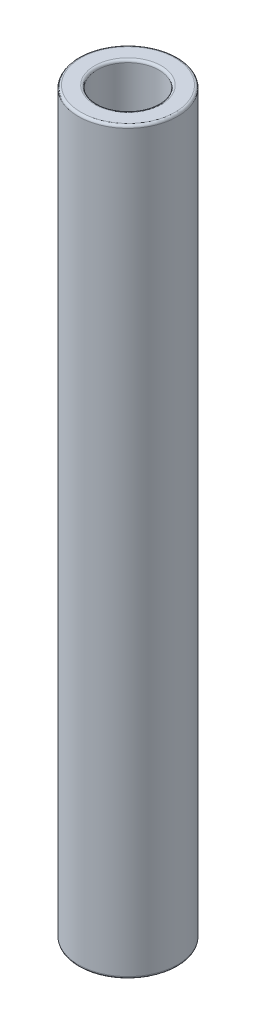
ISO-10303-21;
HEADER;
FILE_DESCRIPTION(('STEP AP214'),'2;1');
FILE_NAME('part.step','',(''),(''),'','','');
FILE_SCHEMA(('AUTOMOTIVE_DESIGN { 1 0 10303 214 1 1 1 1 }'));
ENDSEC;
DATA;
#1=APPLICATION_CONTEXT('core data for automotive mechanical design processes');
#2=APPLICATION_PROTOCOL_DEFINITION('international standard','automotive_design',2000,#1);
#3=PRODUCT_CONTEXT('',#1,'mechanical');
#4=PRODUCT('Part','Part','',(#3));
#5=PRODUCT_RELATED_PRODUCT_CATEGORY('part','',(#4));
#6=PRODUCT_DEFINITION_FORMATION('','',#4);
#7=PRODUCT_DEFINITION_CONTEXT('part definition',#1,'design');
#8=PRODUCT_DEFINITION('design','',#6,#7);
#9=PRODUCT_DEFINITION_SHAPE('','',#8);
#10=(LENGTH_UNIT() NAMED_UNIT(*) SI_UNIT(.MILLI.,.METRE.));
#11=(NAMED_UNIT(*) PLANE_ANGLE_UNIT() SI_UNIT($,.RADIAN.));
#12=(NAMED_UNIT(*) SI_UNIT($,.STERADIAN.) SOLID_ANGLE_UNIT());
#13=UNCERTAINTY_MEASURE_WITH_UNIT(LENGTH_MEASURE(1.E-05),#10,'distance_accuracy_value','');
#14=(GEOMETRIC_REPRESENTATION_CONTEXT(3) GLOBAL_UNCERTAINTY_ASSIGNED_CONTEXT((#13)) GLOBAL_UNIT_ASSIGNED_CONTEXT((#10,
#11,#12)) REPRESENTATION_CONTEXT('',''));
#15=CARTESIAN_POINT('',(0.,0.,0.));
#16=DIRECTION('',(0.,0.,1.));
#17=DIRECTION('',(1.,0.,0.));
#18=AXIS2_PLACEMENT_3D('',#15,#16,#17);
#19=CARTESIAN_POINT('',(0.,59.69,0.));
#20=DIRECTION('',(0.,1.,0.));
#21=DIRECTION('',(0.,0.,1.));
#22=AXIS2_PLACEMENT_3D('',#19,#20,#21);
#23=PLANE('',#22);
#24=CARTESIAN_POINT('',(0.,59.69,0.));
#25=DIRECTION('',(0.,1.,0.));
#26=DIRECTION('',(0.,0.,1.));
#27=AXIS2_PLACEMENT_3D('',#24,#25,#26);
#28=CIRCLE('',#27,3.8);
#29=CARTESIAN_POINT('',(0.,59.69,3.8));
#30=VERTEX_POINT('',#29);
#31=EDGE_CURVE('E10',#30,#30,#28,.T.);
#32=ORIENTED_EDGE('',*,*,#31,.T.);
#33=EDGE_LOOP('',(#32));
#34=FACE_BOUND('',#33,.T.);
#35=CARTESIAN_POINT('',(0.,59.69,0.));
#36=DIRECTION('',(0.,1.,0.));
#37=DIRECTION('',(0.,0.,1.));
#38=AXIS2_PLACEMENT_3D('',#35,#36,#37);
#39=CIRCLE('',#38,2.7);
#40=CARTESIAN_POINT('',(0.,59.69,2.7));
#41=VERTEX_POINT('',#40);
#42=EDGE_CURVE('E44',#41,#41,#39,.F.);
#43=ORIENTED_EDGE('',*,*,#42,.T.);
#44=EDGE_LOOP('',(#43));
#45=FACE_BOUND('',#44,.T.);
#46=ADVANCED_FACE('F37',(#34,#45),#23,.T.);
#47=CARTESIAN_POINT('',(0.,0.,0.));
#48=DIRECTION('',(0.,1.,0.));
#49=DIRECTION('',(0.,0.,1.));
#50=AXIS2_PLACEMENT_3D('',#47,#48,#49);
#51=PLANE('',#50);
#52=CARTESIAN_POINT('',(0.,0.,0.));
#53=DIRECTION('',(0.,1.,0.));
#54=DIRECTION('',(0.,0.,1.));
#55=AXIS2_PLACEMENT_3D('',#52,#53,#54);
#56=CIRCLE('',#55,2.7);
#57=CARTESIAN_POINT('',(0.,0.,2.7));
#58=VERTEX_POINT('',#57);
#59=EDGE_CURVE('E63',#58,#58,#56,.T.);
#60=ORIENTED_EDGE('',*,*,#59,.T.);
#61=EDGE_LOOP('',(#60));
#62=FACE_BOUND('',#61,.T.);
#63=CARTESIAN_POINT('',(0.,0.,0.));
#64=DIRECTION('',(0.,1.,0.));
#65=DIRECTION('',(0.,0.,1.));
#66=AXIS2_PLACEMENT_3D('',#63,#64,#65);
#67=CIRCLE('',#66,3.8);
#68=CARTESIAN_POINT('',(0.,0.,3.8));
#69=VERTEX_POINT('',#68);
#70=EDGE_CURVE('E66',#69,#69,#67,.F.);
#71=ORIENTED_EDGE('',*,*,#70,.T.);
#72=EDGE_LOOP('',(#71));
#73=FACE_BOUND('',#72,.T.);
#74=ADVANCED_FACE('F70',(#62,#73),#51,.F.);
#75=CARTESIAN_POINT('',(0.,59.69,0.));
#76=DIRECTION('',(0.,-1.,0.));
#77=DIRECTION('',(0.,0.,-1.));
#78=AXIS2_PLACEMENT_3D('',#75,#76,#77);
#79=CYLINDRICAL_SURFACE('',#78,4.);
#80=CARTESIAN_POINT('',(0.,0.199999999999999,0.));
#81=DIRECTION('',(0.,1.,0.));
#82=DIRECTION('',(0.,0.,1.));
#83=AXIS2_PLACEMENT_3D('',#80,#81,#82);
#84=CIRCLE('',#83,4.);
#85=CARTESIAN_POINT('',(0.,0.199999999999992,-4.));
#86=VERTEX_POINT('',#85);
#87=EDGE_CURVE('E48',#86,#86,#84,.T.);
#88=CARTESIAN_POINT('',(0.,59.49,0.));
#89=DIRECTION('',(0.,1.,0.));
#90=DIRECTION('',(0.,0.,1.));
#91=AXIS2_PLACEMENT_3D('',#88,#89,#90);
#92=CIRCLE('',#91,4.);
#93=CARTESIAN_POINT('',(0.,59.49,-4.));
#94=VERTEX_POINT('',#93);
#95=EDGE_CURVE('E52',#94,#94,#92,.F.);
#96=CARTESIAN_POINT('',(0.,0.199999999999992,-4.));
#97=CARTESIAN_POINT('',(0.,0.81760416666666,-4.));
#98=CARTESIAN_POINT('',(0.,1.43520833333333,-4.));
#99=CARTESIAN_POINT('',(0.,2.67041666666666,-4.));
#100=CARTESIAN_POINT('',(0.,3.28802083333333,-4.));
#101=CARTESIAN_POINT('',(0.,4.52322916666666,-4.));
#102=CARTESIAN_POINT('',(0.,5.14083333333333,-4.));
#103=CARTESIAN_POINT('',(0.,6.37604166666666,-4.));
#104=CARTESIAN_POINT('',(0.,6.99364583333333,-4.));
#105=CARTESIAN_POINT('',(0.,8.22885416666666,-4.));
#106=CARTESIAN_POINT('',(0.,8.84645833333333,-4.));
#107=CARTESIAN_POINT('',(0.,10.0816666666667,-4.));
#108=CARTESIAN_POINT('',(0.,10.6992708333333,-4.));
#109=CARTESIAN_POINT('',(0.,11.9344791666667,-4.));
#110=CARTESIAN_POINT('',(0.,12.5520833333333,-4.));
#111=CARTESIAN_POINT('',(0.,13.7872916666667,-4.));
#112=CARTESIAN_POINT('',(0.,14.4048958333333,-4.));
#113=CARTESIAN_POINT('',(0.,15.6401041666667,-4.));
#114=CARTESIAN_POINT('',(0.,16.2577083333333,-4.));
#115=CARTESIAN_POINT('',(0.,17.4929166666667,-4.));
#116=CARTESIAN_POINT('',(0.,18.1105208333333,-4.));
#117=CARTESIAN_POINT('',(0.,19.3457291666667,-4.));
#118=CARTESIAN_POINT('',(0.,19.9633333333333,-4.));
#119=CARTESIAN_POINT('',(0.,21.1985416666667,-4.));
#120=CARTESIAN_POINT('',(0.,21.8161458333333,-4.));
#121=CARTESIAN_POINT('',(0.,23.0513541666667,-4.));
#122=CARTESIAN_POINT('',(0.,23.6689583333333,-4.));
#123=CARTESIAN_POINT('',(0.,24.9041666666667,-4.));
#124=CARTESIAN_POINT('',(0.,25.5217708333333,-4.));
#125=CARTESIAN_POINT('',(0.,26.7569791666667,-4.));
#126=CARTESIAN_POINT('',(0.,27.3745833333333,-4.));
#127=CARTESIAN_POINT('',(0.,28.6097916666667,-4.));
#128=CARTESIAN_POINT('',(0.,29.2273958333333,-4.));
#129=CARTESIAN_POINT('',(0.,30.4626041666667,-4.));
#130=CARTESIAN_POINT('',(0.,31.0802083333333,-4.));
#131=CARTESIAN_POINT('',(0.,32.3154166666667,-4.));
#132=CARTESIAN_POINT('',(0.,32.9330208333333,-4.));
#133=CARTESIAN_POINT('',(0.,34.1682291666667,-4.));
#134=CARTESIAN_POINT('',(0.,34.7858333333333,-4.));
#135=CARTESIAN_POINT('',(0.,36.0210416666667,-4.));
#136=CARTESIAN_POINT('',(0.,36.6386458333333,-4.));
#137=CARTESIAN_POINT('',(0.,37.8738541666667,-4.));
#138=CARTESIAN_POINT('',(0.,38.4914583333333,-4.));
#139=CARTESIAN_POINT('',(0.,39.7266666666667,-4.));
#140=CARTESIAN_POINT('',(0.,40.3442708333333,-4.));
#141=CARTESIAN_POINT('',(0.,41.5794791666667,-4.));
#142=CARTESIAN_POINT('',(0.,42.1970833333333,-4.));
#143=CARTESIAN_POINT('',(0.,43.4322916666667,-4.));
#144=CARTESIAN_POINT('',(0.,44.0498958333333,-4.));
#145=CARTESIAN_POINT('',(0.,45.2851041666667,-4.));
#146=CARTESIAN_POINT('',(0.,45.9027083333333,-4.));
#147=CARTESIAN_POINT('',(0.,47.1379166666667,-4.));
#148=CARTESIAN_POINT('',(0.,47.7555208333333,-4.));
#149=CARTESIAN_POINT('',(0.,48.9907291666667,-4.));
#150=CARTESIAN_POINT('',(0.,49.6083333333333,-4.));
#151=CARTESIAN_POINT('',(0.,50.8435416666667,-4.));
#152=CARTESIAN_POINT('',(0.,51.4611458333333,-4.));
#153=CARTESIAN_POINT('',(0.,52.6963541666667,-4.));
#154=CARTESIAN_POINT('',(0.,53.3139583333333,-4.));
#155=CARTESIAN_POINT('',(0.,54.5491666666667,-4.));
#156=CARTESIAN_POINT('',(0.,55.1667708333333,-4.));
#157=CARTESIAN_POINT('',(0.,56.4019791666667,-4.));
#158=CARTESIAN_POINT('',(0.,57.0195833333333,-4.));
#159=CARTESIAN_POINT('',(0.,58.2547916666667,-4.));
#160=CARTESIAN_POINT('',(0.,58.8723958333333,-4.));
#161=CARTESIAN_POINT('',(0.,59.49,-4.));
#162=B_SPLINE_CURVE_WITH_KNOTS('',3,(#96,#97,#98,#99,#100,#101,#102,#103,#104,#105,#106,#107,
#108,#109,#110,#111,#112,#113,#114,#115,#116,#117,#118,#119,#120,#121,#122,#123,#124,#125,#126,
#127,#128,#129,#130,#131,#132,#133,#134,#135,#136,#137,#138,#139,#140,#141,#142,#143,#144,#145,
#146,#147,#148,#149,#150,#151,#152,#153,#154,#155,#156,#157,#158,#159,#160,#161),.UNSPECIFIED.,
.F.,.F.,(4,2,2,2,2,2,2,2,2,2,2,2,2,2,2,2,2,2,2,2,2,2,2,2,2,2,2,2,2,2,2,2,4),(0.,1.8528125,
3.705625,5.5584375,7.41125,9.2640625,11.116875,12.9696875,14.8225,16.6753125,18.528125,
20.3809375,22.23375,24.0865625,25.939375,27.7921875,29.645,31.4978125,33.350625,35.2034375,
37.05625,38.9090625,40.761875,42.6146875,44.4675,46.3203125,48.173125,50.0259375,51.87875,
53.7315625,55.584375,57.4371875,59.29),.UNSPECIFIED.);
#163=EDGE_CURVE('BSEAM80',#86,#94,#162,.T.);
#164=ORIENTED_EDGE('',*,*,#87,.T.);
#165=ORIENTED_EDGE('',*,*,#95,.T.);
#166=ORIENTED_EDGE('',*,*,#163,.T.);
#167=ORIENTED_EDGE('',*,*,#163,.F.);
#168=EDGE_LOOP('',(#164,#166,#165,#167));
#169=FACE_BOUND('',#168,.T.);
#170=ADVANCED_FACE('F80',(#169),#79,.T.);
#171=CARTESIAN_POINT('',(0.,59.69,0.));
#172=DIRECTION('',(0.,-1.,0.));
#173=DIRECTION('',(0.,0.,-1.));
#174=AXIS2_PLACEMENT_3D('',#171,#172,#173);
#175=CYLINDRICAL_SURFACE('',#174,2.5);
#176=CARTESIAN_POINT('',(0.,0.199999999999999,0.));
#177=DIRECTION('',(0.,1.,0.));
#178=DIRECTION('',(0.,0.,1.));
#179=AXIS2_PLACEMENT_3D('',#176,#177,#178);
#180=CIRCLE('',#179,2.5);
#181=CARTESIAN_POINT('',(0.,0.199999999999992,-2.5));
#182=VERTEX_POINT('',#181);
#183=EDGE_CURVE('E57',#182,#182,#180,.F.);
#184=CARTESIAN_POINT('',(0.,59.49,0.));
#185=DIRECTION('',(0.,1.,0.));
#186=DIRECTION('',(0.,0.,1.));
#187=AXIS2_PLACEMENT_3D('',#184,#185,#186);
#188=CIRCLE('',#187,2.5);
#189=CARTESIAN_POINT('',(0.,59.49,-2.5));
#190=VERTEX_POINT('',#189);
#191=EDGE_CURVE('E60',#190,#190,#188,.T.);
#192=CARTESIAN_POINT('',(0.,0.199999999999992,-2.5));
#193=CARTESIAN_POINT('',(0.,0.81760416666666,-2.5));
#194=CARTESIAN_POINT('',(0.,1.43520833333333,-2.5));
#195=CARTESIAN_POINT('',(0.,2.67041666666666,-2.5));
#196=CARTESIAN_POINT('',(0.,3.28802083333333,-2.5));
#197=CARTESIAN_POINT('',(0.,4.52322916666666,-2.5));
#198=CARTESIAN_POINT('',(0.,5.14083333333333,-2.5));
#199=CARTESIAN_POINT('',(0.,6.37604166666666,-2.5));
#200=CARTESIAN_POINT('',(0.,6.99364583333333,-2.5));
#201=CARTESIAN_POINT('',(0.,8.22885416666666,-2.5));
#202=CARTESIAN_POINT('',(0.,8.84645833333333,-2.5));
#203=CARTESIAN_POINT('',(0.,10.0816666666667,-2.5));
#204=CARTESIAN_POINT('',(0.,10.6992708333333,-2.5));
#205=CARTESIAN_POINT('',(0.,11.9344791666667,-2.5));
#206=CARTESIAN_POINT('',(0.,12.5520833333333,-2.5));
#207=CARTESIAN_POINT('',(0.,13.7872916666667,-2.5));
#208=CARTESIAN_POINT('',(0.,14.4048958333333,-2.5));
#209=CARTESIAN_POINT('',(0.,15.6401041666667,-2.5));
#210=CARTESIAN_POINT('',(0.,16.2577083333333,-2.5));
#211=CARTESIAN_POINT('',(0.,17.4929166666667,-2.5));
#212=CARTESIAN_POINT('',(0.,18.1105208333333,-2.5));
#213=CARTESIAN_POINT('',(0.,19.3457291666667,-2.5));
#214=CARTESIAN_POINT('',(0.,19.9633333333333,-2.5));
#215=CARTESIAN_POINT('',(0.,21.1985416666667,-2.5));
#216=CARTESIAN_POINT('',(0.,21.8161458333333,-2.5));
#217=CARTESIAN_POINT('',(0.,23.0513541666667,-2.5));
#218=CARTESIAN_POINT('',(0.,23.6689583333333,-2.5));
#219=CARTESIAN_POINT('',(0.,24.9041666666667,-2.5));
#220=CARTESIAN_POINT('',(0.,25.5217708333333,-2.5));
#221=CARTESIAN_POINT('',(0.,26.7569791666667,-2.5));
#222=CARTESIAN_POINT('',(0.,27.3745833333333,-2.5));
#223=CARTESIAN_POINT('',(0.,28.6097916666667,-2.5));
#224=CARTESIAN_POINT('',(0.,29.2273958333333,-2.5));
#225=CARTESIAN_POINT('',(0.,30.4626041666667,-2.5));
#226=CARTESIAN_POINT('',(0.,31.0802083333333,-2.5));
#227=CARTESIAN_POINT('',(0.,32.3154166666667,-2.5));
#228=CARTESIAN_POINT('',(0.,32.9330208333333,-2.5));
#229=CARTESIAN_POINT('',(0.,34.1682291666667,-2.5));
#230=CARTESIAN_POINT('',(0.,34.7858333333333,-2.5));
#231=CARTESIAN_POINT('',(0.,36.0210416666667,-2.5));
#232=CARTESIAN_POINT('',(0.,36.6386458333333,-2.5));
#233=CARTESIAN_POINT('',(0.,37.8738541666667,-2.5));
#234=CARTESIAN_POINT('',(0.,38.4914583333333,-2.5));
#235=CARTESIAN_POINT('',(0.,39.7266666666667,-2.5));
#236=CARTESIAN_POINT('',(0.,40.3442708333333,-2.5));
#237=CARTESIAN_POINT('',(0.,41.5794791666667,-2.5));
#238=CARTESIAN_POINT('',(0.,42.1970833333333,-2.5));
#239=CARTESIAN_POINT('',(0.,43.4322916666667,-2.5));
#240=CARTESIAN_POINT('',(0.,44.0498958333333,-2.5));
#241=CARTESIAN_POINT('',(0.,45.2851041666667,-2.5));
#242=CARTESIAN_POINT('',(0.,45.9027083333333,-2.5));
#243=CARTESIAN_POINT('',(0.,47.1379166666667,-2.5));
#244=CARTESIAN_POINT('',(0.,47.7555208333333,-2.5));
#245=CARTESIAN_POINT('',(0.,48.9907291666667,-2.5));
#246=CARTESIAN_POINT('',(0.,49.6083333333333,-2.5));
#247=CARTESIAN_POINT('',(0.,50.8435416666667,-2.5));
#248=CARTESIAN_POINT('',(0.,51.4611458333333,-2.5));
#249=CARTESIAN_POINT('',(0.,52.6963541666667,-2.5));
#250=CARTESIAN_POINT('',(0.,53.3139583333333,-2.5));
#251=CARTESIAN_POINT('',(0.,54.5491666666667,-2.5));
#252=CARTESIAN_POINT('',(0.,55.1667708333333,-2.5));
#253=CARTESIAN_POINT('',(0.,56.4019791666667,-2.5));
#254=CARTESIAN_POINT('',(0.,57.0195833333333,-2.5));
#255=CARTESIAN_POINT('',(0.,58.2547916666667,-2.5));
#256=CARTESIAN_POINT('',(0.,58.8723958333333,-2.5));
#257=CARTESIAN_POINT('',(0.,59.49,-2.5));
#258=B_SPLINE_CURVE_WITH_KNOTS('',3,(#192,#193,#194,#195,#196,#197,#198,#199,#200,#201,#202,
#203,#204,#205,#206,#207,#208,#209,#210,#211,#212,#213,#214,#215,#216,#217,#218,#219,#220,#221,
#222,#223,#224,#225,#226,#227,#228,#229,#230,#231,#232,#233,#234,#235,#236,#237,#238,#239,#240,
#241,#242,#243,#244,#245,#246,#247,#248,#249,#250,#251,#252,#253,#254,#255,#256,#257),
.UNSPECIFIED.,.F.,.F.,(4,2,2,2,2,2,2,2,2,2,2,2,2,2,2,2,2,2,2,2,2,2,2,2,2,2,2,2,2,2,2,2,4),(0.,
1.8528125,3.705625,5.5584375,7.41125,9.2640625,11.116875,12.9696875,14.8225,16.6753125,
18.528125,20.3809375,22.23375,24.0865625,25.939375,27.7921875,29.645,31.4978125,33.350625,
35.2034375,37.05625,38.9090625,40.761875,42.6146875,44.4675,46.3203125,48.173125,50.0259375,
51.87875,53.7315625,55.584375,57.4371875,59.29),.UNSPECIFIED.);
#259=EDGE_CURVE('BSEAM83',#182,#190,#258,.T.);
#260=ORIENTED_EDGE('',*,*,#183,.T.);
#261=ORIENTED_EDGE('',*,*,#191,.T.);
#262=ORIENTED_EDGE('',*,*,#259,.T.);
#263=ORIENTED_EDGE('',*,*,#259,.F.);
#264=EDGE_LOOP('',(#260,#262,#261,#263));
#265=FACE_BOUND('',#264,.T.);
#266=ADVANCED_FACE('F83',(#265),#175,.F.);
#267=CARTESIAN_POINT('',(0.,0.199999999999999,0.));
#268=DIRECTION('',(0.,1.,0.));
#269=DIRECTION('',(0.,0.,1.));
#270=AXIS2_PLACEMENT_3D('',#267,#268,#269);
#271=TOROIDAL_SURFACE('',#270,2.7,0.2);
#272=ORIENTED_EDGE('',*,*,#183,.F.);
#273=EDGE_LOOP('',(#272));
#274=FACE_BOUND('',#273,.T.);
#275=ORIENTED_EDGE('',*,*,#59,.F.);
#276=EDGE_LOOP('',(#275));
#277=FACE_BOUND('',#276,.T.);
#278=ADVANCED_FACE('F76',(#274,#277),#271,.T.);
#279=CARTESIAN_POINT('',(0.,0.199999999999999,0.));
#280=DIRECTION('',(0.,1.,0.));
#281=DIRECTION('',(0.,0.,1.));
#282=AXIS2_PLACEMENT_3D('',#279,#280,#281);
#283=TOROIDAL_SURFACE('',#282,3.8,0.2);
#284=ORIENTED_EDGE('',*,*,#70,.F.);
#285=EDGE_LOOP('',(#284));
#286=FACE_BOUND('',#285,.T.);
#287=ORIENTED_EDGE('',*,*,#87,.F.);
#288=EDGE_LOOP('',(#287));
#289=FACE_BOUND('',#288,.T.);
#290=ADVANCED_FACE('F72',(#286,#289),#283,.T.);
#291=CARTESIAN_POINT('',(0.,59.49,0.));
#292=DIRECTION('',(0.,1.,0.));
#293=DIRECTION('',(0.,0.,1.));
#294=AXIS2_PLACEMENT_3D('',#291,#292,#293);
#295=TOROIDAL_SURFACE('',#294,3.8,0.2);
#296=ORIENTED_EDGE('',*,*,#95,.F.);
#297=EDGE_LOOP('',(#296));
#298=FACE_BOUND('',#297,.T.);
#299=ORIENTED_EDGE('',*,*,#31,.F.);
#300=EDGE_LOOP('',(#299));
#301=FACE_BOUND('',#300,.T.);
#302=ADVANCED_FACE('F75',(#298,#301),#295,.T.);
#303=CARTESIAN_POINT('',(0.,59.49,0.));
#304=DIRECTION('',(0.,1.,0.));
#305=DIRECTION('',(0.,0.,1.));
#306=AXIS2_PLACEMENT_3D('',#303,#304,#305);
#307=TOROIDAL_SURFACE('',#306,2.7,0.2);
#308=ORIENTED_EDGE('',*,*,#42,.F.);
#309=EDGE_LOOP('',(#308));
#310=FACE_BOUND('',#309,.T.);
#311=ORIENTED_EDGE('',*,*,#191,.F.);
#312=EDGE_LOOP('',(#311));
#313=FACE_BOUND('',#312,.T.);
#314=ADVANCED_FACE('F39',(#310,#313),#307,.T.);
#315=CLOSED_SHELL('',(#46,#74,#170,#266,#278,#290,#302,#314));
#316=MANIFOLD_SOLID_BREP('B2',#315);
#317=ADVANCED_BREP_SHAPE_REPRESENTATION('',(#18,#316),#14);
#318=SHAPE_DEFINITION_REPRESENTATION(#9,#317);
ENDSEC;
END-ISO-10303-21;
